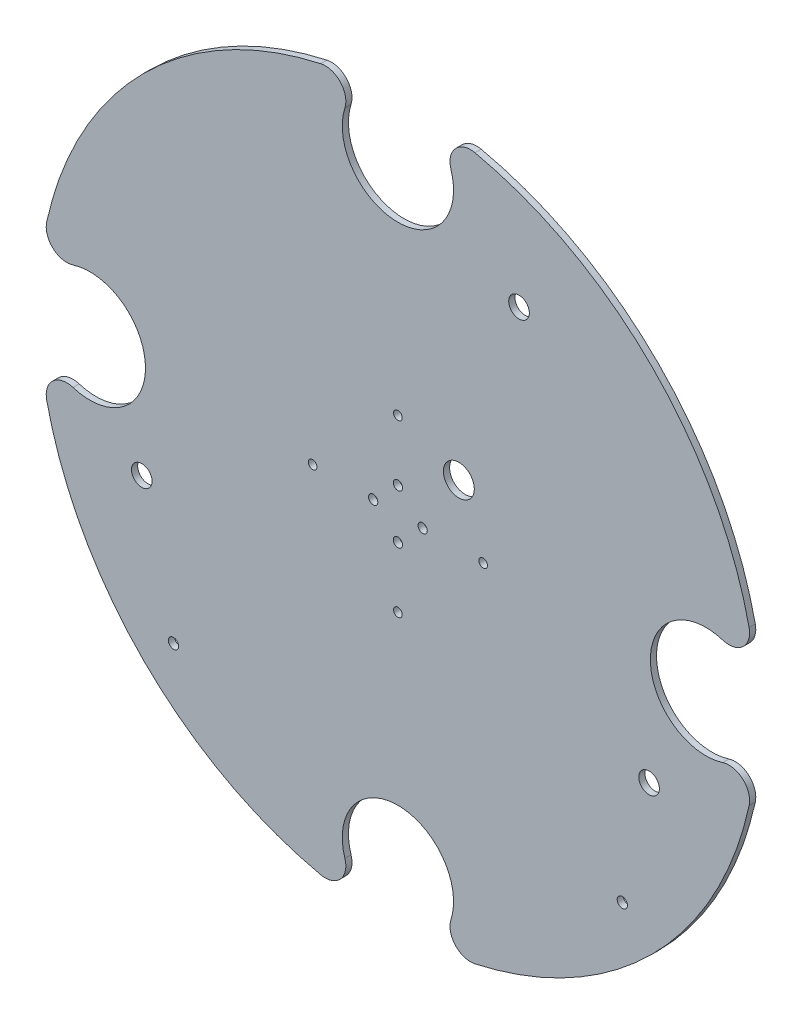
ISO-10303-21;
HEADER;
FILE_DESCRIPTION(('STEP AP214'),'2;1');
FILE_NAME('part.step','',(''),(''),'','','');
FILE_SCHEMA(('AUTOMOTIVE_DESIGN { 1 0 10303 214 1 1 1 1 }'));
ENDSEC;
DATA;
#1=APPLICATION_CONTEXT('core data for automotive mechanical design processes');
#2=APPLICATION_PROTOCOL_DEFINITION('international standard','automotive_design',2000,#1);
#3=PRODUCT_CONTEXT('',#1,'mechanical');
#4=PRODUCT('Part','Part','',(#3));
#5=PRODUCT_RELATED_PRODUCT_CATEGORY('part','',(#4));
#6=PRODUCT_DEFINITION_FORMATION('','',#4);
#7=PRODUCT_DEFINITION_CONTEXT('part definition',#1,'design');
#8=PRODUCT_DEFINITION('design','',#6,#7);
#9=PRODUCT_DEFINITION_SHAPE('','',#8);
#10=(LENGTH_UNIT() NAMED_UNIT(*) SI_UNIT(.MILLI.,.METRE.));
#11=(NAMED_UNIT(*) PLANE_ANGLE_UNIT() SI_UNIT($,.RADIAN.));
#12=(NAMED_UNIT(*) SI_UNIT($,.STERADIAN.) SOLID_ANGLE_UNIT());
#13=UNCERTAINTY_MEASURE_WITH_UNIT(LENGTH_MEASURE(1.E-05),#10,'distance_accuracy_value','');
#14=(GEOMETRIC_REPRESENTATION_CONTEXT(3) GLOBAL_UNCERTAINTY_ASSIGNED_CONTEXT((#13)) GLOBAL_UNIT_ASSIGNED_CONTEXT((#10,
#11,#12)) REPRESENTATION_CONTEXT('',''));
#15=CARTESIAN_POINT('',(0.,0.,0.));
#16=DIRECTION('',(0.,0.,1.));
#17=DIRECTION('',(1.,0.,0.));
#18=AXIS2_PLACEMENT_3D('',#15,#16,#17);
#19=CARTESIAN_POINT('',(0.,0.,3.));
#20=DIRECTION('',(0.,0.,-1.));
#21=DIRECTION('',(-1.,0.,0.));
#22=AXIS2_PLACEMENT_3D('',#19,#20,#21);
#23=CYLINDRICAL_SURFACE('',#22,174.5);
#24=CARTESIAN_POINT('',(0.,0.,0.));
#25=DIRECTION('',(0.,0.,1.));
#26=DIRECTION('',(1.,0.,0.));
#27=AXIS2_PLACEMENT_3D('',#24,#25,#26);
#28=CIRCLE('',#27,174.5);
#29=CARTESIAN_POINT('',(170.441324170741,37.4166408824233,0.));
#30=VERTEX_POINT('',#29);
#31=CARTESIAN_POINT('',(37.4166408824233,170.441324170741,0.));
#32=VERTEX_POINT('',#31);
#33=EDGE_CURVE('E249',#30,#32,#28,.T.);
#34=ORIENTED_EDGE('',*,*,#33,.T.);
#35=DIRECTION('',(0.,0.,-1.));
#36=VECTOR('',#35,1.);
#37=CARTESIAN_POINT('',(37.4166408824233,170.441324170741,3.));
#38=LINE('',#37,#36);
#39=CARTESIAN_POINT('',(37.4166408824233,170.441324170741,3.));
#40=VERTEX_POINT('',#39);
#41=EDGE_CURVE('E11',#40,#32,#38,.T.);
#42=ORIENTED_EDGE('',*,*,#41,.F.);
#43=CARTESIAN_POINT('',(0.,0.,3.));
#44=DIRECTION('',(0.,0.,1.));
#45=DIRECTION('',(1.,0.,0.));
#46=AXIS2_PLACEMENT_3D('',#43,#44,#45);
#47=CIRCLE('',#46,174.5);
#48=CARTESIAN_POINT('',(170.441324170741,37.4166408824233,3.));
#49=VERTEX_POINT('',#48);
#50=EDGE_CURVE('E370',#49,#40,#47,.T.);
#51=ORIENTED_EDGE('',*,*,#50,.F.);
#52=DIRECTION('',(0.,0.,-1.));
#53=VECTOR('',#52,1.);
#54=CARTESIAN_POINT('',(170.441324170741,37.4166408824233,3.));
#55=LINE('',#54,#53);
#56=EDGE_CURVE('E59',#49,#30,#55,.T.);
#57=ORIENTED_EDGE('',*,*,#56,.T.);
#58=EDGE_LOOP('',(#34,#42,#51,#57));
#59=FACE_BOUND('',#58,.T.);
#60=ADVANCED_FACE('F41',(#59),#23,.T.);
#61=CARTESIAN_POINT('',(35.272420774548,160.673913043478,3.));
#62=DIRECTION('',(0.,0.,-1.));
#63=DIRECTION('',(-1.,0.,0.));
#64=AXIS2_PLACEMENT_3D('',#61,#62,#63);
#65=CYLINDRICAL_SURFACE('',#64,9.99999999999998);
#66=CARTESIAN_POINT('',(35.272420774548,160.673913043478,0.));
#67=DIRECTION('',(0.,0.,1.));
#68=DIRECTION('',(1.,0.,0.));
#69=AXIS2_PLACEMENT_3D('',#66,#67,#68);
#70=CIRCLE('',#69,9.99999999999998);
#71=CARTESIAN_POINT('',(25.7393340787242,157.653936545241,0.));
#72=VERTEX_POINT('',#71);
#73=EDGE_CURVE('E252',#32,#72,#70,.T.);
#74=ORIENTED_EDGE('',*,*,#73,.T.);
#75=DIRECTION('',(0.,0.,-1.));
#76=VECTOR('',#75,1.);
#77=CARTESIAN_POINT('',(25.7393340787242,157.653936545241,3.));
#78=LINE('',#77,#76);
#79=CARTESIAN_POINT('',(25.7393340787242,157.653936545241,3.));
#80=VERTEX_POINT('',#79);
#81=EDGE_CURVE('E51',#80,#72,#78,.T.);
#82=ORIENTED_EDGE('',*,*,#81,.F.);
#83=CARTESIAN_POINT('',(35.272420774548,160.673913043478,3.));
#84=DIRECTION('',(0.,0.,1.));
#85=DIRECTION('',(1.,0.,0.));
#86=AXIS2_PLACEMENT_3D('',#83,#84,#85);
#87=CIRCLE('',#86,9.99999999999998);
#88=EDGE_CURVE('E121',#40,#80,#87,.T.);
#89=ORIENTED_EDGE('',*,*,#88,.F.);
#90=ORIENTED_EDGE('',*,*,#41,.T.);
#91=EDGE_LOOP('',(#74,#82,#89,#90));
#92=FACE_BOUND('',#91,.T.);
#93=ADVANCED_FACE('F351',(#92),#65,.T.);
#94=CARTESIAN_POINT('',(0.,149.5,3.));
#95=DIRECTION('',(0.,0.,-1.));
#96=DIRECTION('',(-1.,0.,0.));
#97=AXIS2_PLACEMENT_3D('',#94,#95,#96);
#98=CYLINDRICAL_SURFACE('',#97,26.9999999999998);
#99=CARTESIAN_POINT('',(0.,149.5,0.));
#100=DIRECTION('',(0.,0.,1.));
#101=DIRECTION('',(1.,0.,0.));
#102=AXIS2_PLACEMENT_3D('',#99,#100,#101);
#103=CIRCLE('',#102,26.9999999999998);
#104=CARTESIAN_POINT('',(-25.7393340787242,157.653936545241,0.));
#105=VERTEX_POINT('',#104);
#106=EDGE_CURVE('E256',#105,#72,#103,.T.);
#107=ORIENTED_EDGE('',*,*,#106,.F.);
#108=DIRECTION('',(0.,0.,-1.));
#109=VECTOR('',#108,1.);
#110=CARTESIAN_POINT('',(-25.7393340787242,157.653936545241,3.));
#111=LINE('',#110,#109);
#112=CARTESIAN_POINT('',(-25.7393340787242,157.653936545241,3.));
#113=VERTEX_POINT('',#112);
#114=EDGE_CURVE('E342',#113,#105,#111,.T.);
#115=ORIENTED_EDGE('',*,*,#114,.F.);
#116=CARTESIAN_POINT('',(0.,149.5,3.));
#117=DIRECTION('',(0.,0.,1.));
#118=DIRECTION('',(1.,0.,0.));
#119=AXIS2_PLACEMENT_3D('',#116,#117,#118);
#120=CIRCLE('',#119,26.9999999999998);
#121=EDGE_CURVE('E350',#113,#80,#120,.T.);
#122=ORIENTED_EDGE('',*,*,#121,.T.);
#123=ORIENTED_EDGE('',*,*,#81,.T.);
#124=EDGE_LOOP('',(#107,#115,#122,#123));
#125=FACE_BOUND('',#124,.T.);
#126=ADVANCED_FACE('F348',(#125),#98,.F.);
#127=CARTESIAN_POINT('',(-35.2724207745481,160.673913043478,3.));
#128=DIRECTION('',(0.,0.,-1.));
#129=DIRECTION('',(-1.,0.,0.));
#130=AXIS2_PLACEMENT_3D('',#127,#128,#129);
#131=CYLINDRICAL_SURFACE('',#130,9.99999999999998);
#132=CARTESIAN_POINT('',(-35.2724207745481,160.673913043478,0.));
#133=DIRECTION('',(0.,0.,1.));
#134=DIRECTION('',(1.,0.,0.));
#135=AXIS2_PLACEMENT_3D('',#132,#133,#134);
#136=CIRCLE('',#135,9.99999999999998);
#137=CARTESIAN_POINT('',(-37.4166408824233,170.441324170741,0.));
#138=VERTEX_POINT('',#137);
#139=EDGE_CURVE('E260',#138,#105,#136,.F.);
#140=ORIENTED_EDGE('',*,*,#139,.F.);
#141=DIRECTION('',(0.,0.,-1.));
#142=VECTOR('',#141,1.);
#143=CARTESIAN_POINT('',(-37.4166408824233,170.441324170741,3.));
#144=LINE('',#143,#142);
#145=CARTESIAN_POINT('',(-37.4166408824233,170.441324170741,3.));
#146=VERTEX_POINT('',#145);
#147=EDGE_CURVE('E339',#146,#138,#144,.T.);
#148=ORIENTED_EDGE('',*,*,#147,.F.);
#149=CARTESIAN_POINT('',(-35.2724207745481,160.673913043478,3.));
#150=DIRECTION('',(0.,0.,1.));
#151=DIRECTION('',(1.,0.,0.));
#152=AXIS2_PLACEMENT_3D('',#149,#150,#151);
#153=CIRCLE('',#152,9.99999999999998);
#154=EDGE_CURVE('E363',#146,#113,#153,.F.);
#155=ORIENTED_EDGE('',*,*,#154,.T.);
#156=ORIENTED_EDGE('',*,*,#114,.T.);
#157=EDGE_LOOP('',(#140,#148,#155,#156));
#158=FACE_BOUND('',#157,.T.);
#159=ADVANCED_FACE('F359',(#158),#131,.T.);
#160=CARTESIAN_POINT('',(0.,0.,3.));
#161=DIRECTION('',(0.,0.,-1.));
#162=DIRECTION('',(-1.,0.,0.));
#163=AXIS2_PLACEMENT_3D('',#160,#161,#162);
#164=CYLINDRICAL_SURFACE('',#163,174.5);
#165=CARTESIAN_POINT('',(0.,0.,0.));
#166=DIRECTION('',(0.,0.,1.));
#167=DIRECTION('',(1.,0.,0.));
#168=AXIS2_PLACEMENT_3D('',#165,#166,#167);
#169=CIRCLE('',#168,174.5);
#170=CARTESIAN_POINT('',(-170.441324170741,37.4166408824233,0.));
#171=VERTEX_POINT('',#170);
#172=EDGE_CURVE('E264',#138,#171,#169,.T.);
#173=ORIENTED_EDGE('',*,*,#172,.T.);
#174=DIRECTION('',(0.,0.,-1.));
#175=VECTOR('',#174,1.);
#176=CARTESIAN_POINT('',(-170.441324170741,37.4166408824233,3.));
#177=LINE('',#176,#175);
#178=CARTESIAN_POINT('',(-170.441324170741,37.4166408824233,3.));
#179=VERTEX_POINT('',#178);
#180=EDGE_CURVE('E335',#179,#171,#177,.T.);
#181=ORIENTED_EDGE('',*,*,#180,.F.);
#182=CARTESIAN_POINT('',(0.,0.,3.));
#183=DIRECTION('',(0.,0.,1.));
#184=DIRECTION('',(1.,0.,0.));
#185=AXIS2_PLACEMENT_3D('',#182,#183,#184);
#186=CIRCLE('',#185,174.5);
#187=EDGE_CURVE('E368',#146,#179,#186,.T.);
#188=ORIENTED_EDGE('',*,*,#187,.F.);
#189=ORIENTED_EDGE('',*,*,#147,.T.);
#190=EDGE_LOOP('',(#173,#181,#188,#189));
#191=FACE_BOUND('',#190,.T.);
#192=ADVANCED_FACE('F719',(#191),#164,.T.);
#193=CARTESIAN_POINT('',(-160.673913043478,35.272420774548,3.));
#194=DIRECTION('',(0.,0.,-1.));
#195=DIRECTION('',(-1.,0.,0.));
#196=AXIS2_PLACEMENT_3D('',#193,#194,#195);
#197=CYLINDRICAL_SURFACE('',#196,9.99999999999997);
#198=CARTESIAN_POINT('',(-160.673913043478,35.272420774548,0.));
#199=DIRECTION('',(0.,0.,1.));
#200=DIRECTION('',(1.,0.,0.));
#201=AXIS2_PLACEMENT_3D('',#198,#199,#200);
#202=CIRCLE('',#201,9.99999999999997);
#203=CARTESIAN_POINT('',(-157.653936545241,25.7393340787242,0.));
#204=VERTEX_POINT('',#203);
#205=EDGE_CURVE('E267',#171,#204,#202,.T.);
#206=ORIENTED_EDGE('',*,*,#205,.T.);
#207=DIRECTION('',(0.,0.,-1.));
#208=VECTOR('',#207,1.);
#209=CARTESIAN_POINT('',(-157.653936545241,25.7393340787242,3.));
#210=LINE('',#209,#208);
#211=CARTESIAN_POINT('',(-157.653936545241,25.7393340787242,3.));
#212=VERTEX_POINT('',#211);
#213=EDGE_CURVE('E332',#212,#204,#210,.T.);
#214=ORIENTED_EDGE('',*,*,#213,.F.);
#215=CARTESIAN_POINT('',(-160.673913043478,35.272420774548,3.));
#216=DIRECTION('',(0.,0.,1.));
#217=DIRECTION('',(1.,0.,0.));
#218=AXIS2_PLACEMENT_3D('',#215,#216,#217);
#219=CIRCLE('',#218,9.99999999999997);
#220=EDGE_CURVE('E376',#179,#212,#219,.T.);
#221=ORIENTED_EDGE('',*,*,#220,.F.);
#222=ORIENTED_EDGE('',*,*,#180,.T.);
#223=EDGE_LOOP('',(#206,#214,#221,#222));
#224=FACE_BOUND('',#223,.T.);
#225=ADVANCED_FACE('F709',(#224),#197,.T.);
#226=CARTESIAN_POINT('',(-149.5,0.,3.));
#227=DIRECTION('',(0.,0.,-1.));
#228=DIRECTION('',(-1.,0.,0.));
#229=AXIS2_PLACEMENT_3D('',#226,#227,#228);
#230=CYLINDRICAL_SURFACE('',#229,26.9999999999998);
#231=CARTESIAN_POINT('',(-149.5,0.,0.));
#232=DIRECTION('',(0.,0.,1.));
#233=DIRECTION('',(1.,0.,0.));
#234=AXIS2_PLACEMENT_3D('',#231,#232,#233);
#235=CIRCLE('',#234,26.9999999999998);
#236=CARTESIAN_POINT('',(-157.653936545241,-25.7393340787242,0.));
#237=VERTEX_POINT('',#236);
#238=EDGE_CURVE('E271',#237,#204,#235,.T.);
#239=ORIENTED_EDGE('',*,*,#238,.F.);
#240=DIRECTION('',(0.,0.,-1.));
#241=VECTOR('',#240,1.);
#242=CARTESIAN_POINT('',(-157.653936545241,-25.7393340787242,3.));
#243=LINE('',#242,#241);
#244=CARTESIAN_POINT('',(-157.653936545241,-25.7393340787242,3.));
#245=VERTEX_POINT('',#244);
#246=EDGE_CURVE('E329',#245,#237,#243,.T.);
#247=ORIENTED_EDGE('',*,*,#246,.F.);
#248=CARTESIAN_POINT('',(-149.5,0.,3.));
#249=DIRECTION('',(0.,0.,1.));
#250=DIRECTION('',(1.,0.,0.));
#251=AXIS2_PLACEMENT_3D('',#248,#249,#250);
#252=CIRCLE('',#251,26.9999999999998);
#253=EDGE_CURVE('E379',#245,#212,#252,.T.);
#254=ORIENTED_EDGE('',*,*,#253,.T.);
#255=ORIENTED_EDGE('',*,*,#213,.T.);
#256=EDGE_LOOP('',(#239,#247,#254,#255));
#257=FACE_BOUND('',#256,.T.);
#258=ADVANCED_FACE('F699',(#257),#230,.F.);
#259=CARTESIAN_POINT('',(-160.673913043478,-35.272420774548,3.));
#260=DIRECTION('',(0.,0.,-1.));
#261=DIRECTION('',(-1.,0.,0.));
#262=AXIS2_PLACEMENT_3D('',#259,#260,#261);
#263=CYLINDRICAL_SURFACE('',#262,9.99999999999997);
#264=CARTESIAN_POINT('',(-160.673913043478,-35.272420774548,0.));
#265=DIRECTION('',(0.,0.,1.));
#266=DIRECTION('',(1.,0.,0.));
#267=AXIS2_PLACEMENT_3D('',#264,#265,#266);
#268=CIRCLE('',#267,9.99999999999997);
#269=CARTESIAN_POINT('',(-170.441324170741,-37.4166408824233,0.));
#270=VERTEX_POINT('',#269);
#271=EDGE_CURVE('E275',#270,#237,#268,.F.);
#272=ORIENTED_EDGE('',*,*,#271,.F.);
#273=DIRECTION('',(0.,0.,-1.));
#274=VECTOR('',#273,1.);
#275=CARTESIAN_POINT('',(-170.441324170741,-37.4166408824233,3.));
#276=LINE('',#275,#274);
#277=CARTESIAN_POINT('',(-170.441324170741,-37.4166408824233,3.));
#278=VERTEX_POINT('',#277);
#279=EDGE_CURVE('E326',#278,#270,#276,.T.);
#280=ORIENTED_EDGE('',*,*,#279,.F.);
#281=CARTESIAN_POINT('',(-160.673913043478,-35.272420774548,3.));
#282=DIRECTION('',(0.,0.,1.));
#283=DIRECTION('',(1.,0.,0.));
#284=AXIS2_PLACEMENT_3D('',#281,#282,#283);
#285=CIRCLE('',#284,9.99999999999997);
#286=EDGE_CURVE('E383',#278,#245,#285,.F.);
#287=ORIENTED_EDGE('',*,*,#286,.T.);
#288=ORIENTED_EDGE('',*,*,#246,.T.);
#289=EDGE_LOOP('',(#272,#280,#287,#288));
#290=FACE_BOUND('',#289,.T.);
#291=ADVANCED_FACE('F687',(#290),#263,.T.);
#292=CARTESIAN_POINT('',(0.,0.,3.));
#293=DIRECTION('',(0.,0.,-1.));
#294=DIRECTION('',(-1.,0.,0.));
#295=AXIS2_PLACEMENT_3D('',#292,#293,#294);
#296=CYLINDRICAL_SURFACE('',#295,174.5);
#297=CARTESIAN_POINT('',(0.,0.,0.));
#298=DIRECTION('',(0.,0.,1.));
#299=DIRECTION('',(1.,0.,0.));
#300=AXIS2_PLACEMENT_3D('',#297,#298,#299);
#301=CIRCLE('',#300,174.5);
#302=CARTESIAN_POINT('',(-37.4166408824233,-170.441324170741,0.));
#303=VERTEX_POINT('',#302);
#304=EDGE_CURVE('E279',#270,#303,#301,.T.);
#305=ORIENTED_EDGE('',*,*,#304,.T.);
#306=DIRECTION('',(0.,0.,-1.));
#307=VECTOR('',#306,1.);
#308=CARTESIAN_POINT('',(-37.4166408824233,-170.441324170741,3.));
#309=LINE('',#308,#307);
#310=CARTESIAN_POINT('',(-37.4166408824233,-170.441324170741,3.));
#311=VERTEX_POINT('',#310);
#312=EDGE_CURVE('E322',#311,#303,#309,.T.);
#313=ORIENTED_EDGE('',*,*,#312,.F.);
#314=CARTESIAN_POINT('',(0.,0.,3.));
#315=DIRECTION('',(0.,0.,1.));
#316=DIRECTION('',(1.,0.,0.));
#317=AXIS2_PLACEMENT_3D('',#314,#315,#316);
#318=CIRCLE('',#317,174.5);
#319=EDGE_CURVE('E387',#278,#311,#318,.T.);
#320=ORIENTED_EDGE('',*,*,#319,.F.);
#321=ORIENTED_EDGE('',*,*,#279,.T.);
#322=EDGE_LOOP('',(#305,#313,#320,#321));
#323=FACE_BOUND('',#322,.T.);
#324=ADVANCED_FACE('F678',(#323),#296,.T.);
#325=CARTESIAN_POINT('',(-35.272420774548,-160.673913043478,3.));
#326=DIRECTION('',(0.,0.,-1.));
#327=DIRECTION('',(-1.,0.,0.));
#328=AXIS2_PLACEMENT_3D('',#325,#326,#327);
#329=CYLINDRICAL_SURFACE('',#328,9.99999999999998);
#330=CARTESIAN_POINT('',(-35.272420774548,-160.673913043478,0.));
#331=DIRECTION('',(0.,0.,1.));
#332=DIRECTION('',(1.,0.,0.));
#333=AXIS2_PLACEMENT_3D('',#330,#331,#332);
#334=CIRCLE('',#333,9.99999999999998);
#335=CARTESIAN_POINT('',(-25.7393340787242,-157.653936545241,0.));
#336=VERTEX_POINT('',#335);
#337=EDGE_CURVE('E282',#303,#336,#334,.T.);
#338=ORIENTED_EDGE('',*,*,#337,.T.);
#339=DIRECTION('',(0.,0.,-1.));
#340=VECTOR('',#339,1.);
#341=CARTESIAN_POINT('',(-25.7393340787242,-157.653936545241,3.));
#342=LINE('',#341,#340);
#343=CARTESIAN_POINT('',(-25.7393340787242,-157.653936545241,3.));
#344=VERTEX_POINT('',#343);
#345=EDGE_CURVE('E319',#344,#336,#342,.T.);
#346=ORIENTED_EDGE('',*,*,#345,.F.);
#347=CARTESIAN_POINT('',(-35.272420774548,-160.673913043478,3.));
#348=DIRECTION('',(0.,0.,1.));
#349=DIRECTION('',(1.,0.,0.));
#350=AXIS2_PLACEMENT_3D('',#347,#348,#349);
#351=CIRCLE('',#350,9.99999999999998);
#352=EDGE_CURVE('E390',#311,#344,#351,.T.);
#353=ORIENTED_EDGE('',*,*,#352,.F.);
#354=ORIENTED_EDGE('',*,*,#312,.T.);
#355=EDGE_LOOP('',(#338,#346,#353,#354));
#356=FACE_BOUND('',#355,.T.);
#357=ADVANCED_FACE('F670',(#356),#329,.T.);
#358=CARTESIAN_POINT('',(0.,-149.5,3.));
#359=DIRECTION('',(0.,0.,-1.));
#360=DIRECTION('',(-1.,0.,0.));
#361=AXIS2_PLACEMENT_3D('',#358,#359,#360);
#362=CYLINDRICAL_SURFACE('',#361,26.9999999999998);
#363=CARTESIAN_POINT('',(0.,-149.5,0.));
#364=DIRECTION('',(0.,0.,1.));
#365=DIRECTION('',(1.,0.,0.));
#366=AXIS2_PLACEMENT_3D('',#363,#364,#365);
#367=CIRCLE('',#366,26.9999999999998);
#368=CARTESIAN_POINT('',(25.7393340787242,-157.653936545241,0.));
#369=VERTEX_POINT('',#368);
#370=EDGE_CURVE('E286',#369,#336,#367,.T.);
#371=ORIENTED_EDGE('',*,*,#370,.F.);
#372=DIRECTION('',(0.,0.,-1.));
#373=VECTOR('',#372,1.);
#374=CARTESIAN_POINT('',(25.7393340787242,-157.653936545241,3.));
#375=LINE('',#374,#373);
#376=CARTESIAN_POINT('',(25.7393340787242,-157.653936545241,3.));
#377=VERTEX_POINT('',#376);
#378=EDGE_CURVE('E316',#377,#369,#375,.T.);
#379=ORIENTED_EDGE('',*,*,#378,.F.);
#380=CARTESIAN_POINT('',(0.,-149.5,3.));
#381=DIRECTION('',(0.,0.,1.));
#382=DIRECTION('',(1.,0.,0.));
#383=AXIS2_PLACEMENT_3D('',#380,#381,#382);
#384=CIRCLE('',#383,26.9999999999998);
#385=EDGE_CURVE('E393',#377,#344,#384,.T.);
#386=ORIENTED_EDGE('',*,*,#385,.T.);
#387=ORIENTED_EDGE('',*,*,#345,.T.);
#388=EDGE_LOOP('',(#371,#379,#386,#387));
#389=FACE_BOUND('',#388,.T.);
#390=ADVANCED_FACE('F409',(#389),#362,.F.);
#391=CARTESIAN_POINT('',(35.2724207745481,-160.673913043478,3.));
#392=DIRECTION('',(0.,0.,-1.));
#393=DIRECTION('',(-1.,0.,0.));
#394=AXIS2_PLACEMENT_3D('',#391,#392,#393);
#395=CYLINDRICAL_SURFACE('',#394,9.99999999999998);
#396=CARTESIAN_POINT('',(35.2724207745481,-160.673913043478,0.));
#397=DIRECTION('',(0.,0.,1.));
#398=DIRECTION('',(1.,0.,0.));
#399=AXIS2_PLACEMENT_3D('',#396,#397,#398);
#400=CIRCLE('',#399,9.99999999999998);
#401=CARTESIAN_POINT('',(37.4166408824233,-170.441324170741,0.));
#402=VERTEX_POINT('',#401);
#403=EDGE_CURVE('E290',#402,#369,#400,.F.);
#404=ORIENTED_EDGE('',*,*,#403,.F.);
#405=DIRECTION('',(0.,0.,-1.));
#406=VECTOR('',#405,1.);
#407=CARTESIAN_POINT('',(37.4166408824233,-170.441324170741,3.));
#408=LINE('',#407,#406);
#409=CARTESIAN_POINT('',(37.4166408824233,-170.441324170741,3.));
#410=VERTEX_POINT('',#409);
#411=EDGE_CURVE('E313',#410,#402,#408,.T.);
#412=ORIENTED_EDGE('',*,*,#411,.F.);
#413=CARTESIAN_POINT('',(35.2724207745481,-160.673913043478,3.));
#414=DIRECTION('',(0.,0.,1.));
#415=DIRECTION('',(1.,0.,0.));
#416=AXIS2_PLACEMENT_3D('',#413,#414,#415);
#417=CIRCLE('',#416,9.99999999999998);
#418=EDGE_CURVE('E397',#410,#377,#417,.F.);
#419=ORIENTED_EDGE('',*,*,#418,.T.);
#420=ORIENTED_EDGE('',*,*,#378,.T.);
#421=EDGE_LOOP('',(#404,#412,#419,#420));
#422=FACE_BOUND('',#421,.T.);
#423=ADVANCED_FACE('F403',(#422),#395,.T.);
#424=CARTESIAN_POINT('',(0.,0.,3.));
#425=DIRECTION('',(0.,0.,-1.));
#426=DIRECTION('',(-1.,0.,0.));
#427=AXIS2_PLACEMENT_3D('',#424,#425,#426);
#428=CYLINDRICAL_SURFACE('',#427,174.5);
#429=CARTESIAN_POINT('',(0.,0.,0.));
#430=DIRECTION('',(0.,0.,1.));
#431=DIRECTION('',(1.,0.,0.));
#432=AXIS2_PLACEMENT_3D('',#429,#430,#431);
#433=CIRCLE('',#432,174.5);
#434=CARTESIAN_POINT('',(170.441324170741,-37.4166408824233,0.));
#435=VERTEX_POINT('',#434);
#436=EDGE_CURVE('E294',#402,#435,#433,.T.);
#437=ORIENTED_EDGE('',*,*,#436,.T.);
#438=DIRECTION('',(0.,0.,-1.));
#439=VECTOR('',#438,1.);
#440=CARTESIAN_POINT('',(170.441324170741,-37.4166408824233,3.));
#441=LINE('',#440,#439);
#442=CARTESIAN_POINT('',(170.441324170741,-37.4166408824233,3.));
#443=VERTEX_POINT('',#442);
#444=EDGE_CURVE('E183',#443,#435,#441,.T.);
#445=ORIENTED_EDGE('',*,*,#444,.F.);
#446=CARTESIAN_POINT('',(0.,0.,3.));
#447=DIRECTION('',(0.,0.,1.));
#448=DIRECTION('',(1.,0.,0.));
#449=AXIS2_PLACEMENT_3D('',#446,#447,#448);
#450=CIRCLE('',#449,174.5);
#451=EDGE_CURVE('E169',#410,#443,#450,.T.);
#452=ORIENTED_EDGE('',*,*,#451,.F.);
#453=ORIENTED_EDGE('',*,*,#411,.T.);
#454=EDGE_LOOP('',(#437,#445,#452,#453));
#455=FACE_BOUND('',#454,.T.);
#456=ADVANCED_FACE('F413',(#455),#428,.T.);
#457=CARTESIAN_POINT('',(160.673913043478,-35.272420774548,3.));
#458=DIRECTION('',(0.,0.,-1.));
#459=DIRECTION('',(-1.,0.,0.));
#460=AXIS2_PLACEMENT_3D('',#457,#458,#459);
#461=CYLINDRICAL_SURFACE('',#460,9.99999999999998);
#462=CARTESIAN_POINT('',(160.673913043478,-35.272420774548,0.));
#463=DIRECTION('',(0.,0.,1.));
#464=DIRECTION('',(1.,0.,0.));
#465=AXIS2_PLACEMENT_3D('',#462,#463,#464);
#466=CIRCLE('',#465,9.99999999999998);
#467=CARTESIAN_POINT('',(157.653936545241,-25.7393340787242,0.));
#468=VERTEX_POINT('',#467);
#469=EDGE_CURVE('E179',#435,#468,#466,.T.);
#470=ORIENTED_EDGE('',*,*,#469,.T.);
#471=DIRECTION('',(0.,0.,-1.));
#472=VECTOR('',#471,1.);
#473=CARTESIAN_POINT('',(157.653936545241,-25.7393340787242,3.));
#474=LINE('',#473,#472);
#475=CARTESIAN_POINT('',(157.653936545241,-25.7393340787242,3.));
#476=VERTEX_POINT('',#475);
#477=EDGE_CURVE('E176',#476,#468,#474,.T.);
#478=ORIENTED_EDGE('',*,*,#477,.F.);
#479=CARTESIAN_POINT('',(160.673913043478,-35.272420774548,3.));
#480=DIRECTION('',(0.,0.,1.));
#481=DIRECTION('',(1.,0.,0.));
#482=AXIS2_PLACEMENT_3D('',#479,#480,#481);
#483=CIRCLE('',#482,9.99999999999998);
#484=EDGE_CURVE('E161',#443,#476,#483,.T.);
#485=ORIENTED_EDGE('',*,*,#484,.F.);
#486=ORIENTED_EDGE('',*,*,#444,.T.);
#487=EDGE_LOOP('',(#470,#478,#485,#486));
#488=FACE_BOUND('',#487,.T.);
#489=ADVANCED_FACE('F177',(#488),#461,.T.);
#490=CARTESIAN_POINT('',(149.5,0.,3.));
#491=DIRECTION('',(0.,0.,-1.));
#492=DIRECTION('',(-1.,0.,0.));
#493=AXIS2_PLACEMENT_3D('',#490,#491,#492);
#494=CYLINDRICAL_SURFACE('',#493,26.9999999999998);
#495=CARTESIAN_POINT('',(149.5,0.,0.));
#496=DIRECTION('',(0.,0.,1.));
#497=DIRECTION('',(1.,0.,0.));
#498=AXIS2_PLACEMENT_3D('',#495,#496,#497);
#499=CIRCLE('',#498,26.9999999999998);
#500=CARTESIAN_POINT('',(157.653936545241,25.7393340787242,0.));
#501=VERTEX_POINT('',#500);
#502=EDGE_CURVE('E299',#501,#468,#499,.T.);
#503=ORIENTED_EDGE('',*,*,#502,.F.);
#504=DIRECTION('',(0.,0.,-1.));
#505=VECTOR('',#504,1.);
#506=CARTESIAN_POINT('',(157.653936545241,25.7393340787242,3.));
#507=LINE('',#506,#505);
#508=CARTESIAN_POINT('',(157.653936545241,25.7393340787242,3.));
#509=VERTEX_POINT('',#508);
#510=EDGE_CURVE('E109',#509,#501,#507,.T.);
#511=ORIENTED_EDGE('',*,*,#510,.F.);
#512=CARTESIAN_POINT('',(149.5,0.,3.));
#513=DIRECTION('',(0.,0.,1.));
#514=DIRECTION('',(1.,0.,0.));
#515=AXIS2_PLACEMENT_3D('',#512,#513,#514);
#516=CIRCLE('',#515,26.9999999999998);
#517=EDGE_CURVE('E166',#509,#476,#516,.T.);
#518=ORIENTED_EDGE('',*,*,#517,.T.);
#519=ORIENTED_EDGE('',*,*,#477,.T.);
#520=EDGE_LOOP('',(#503,#511,#518,#519));
#521=FACE_BOUND('',#520,.T.);
#522=ADVANCED_FACE('F185',(#521),#494,.F.);
#523=CARTESIAN_POINT('',(-108.894444302729,-108.894444302728,3.));
#524=DIRECTION('',(0.,0.,-1.));
#525=DIRECTION('',(-1.,0.,0.));
#526=AXIS2_PLACEMENT_3D('',#523,#524,#525);
#527=CYLINDRICAL_SURFACE('',#526,2.50000000000001);
#528=CARTESIAN_POINT('',(-108.894444302729,-108.894444302728,3.));
#529=DIRECTION('',(0.,0.,1.));
#530=DIRECTION('',(1.,0.,0.));
#531=AXIS2_PLACEMENT_3D('',#528,#529,#530);
#532=CIRCLE('',#531,2.50000000000001);
#533=CARTESIAN_POINT('',(-106.394444302729,-108.894444302728,3.));
#534=VERTEX_POINT('',#533);
#535=EDGE_CURVE('E778',#534,#534,#532,.T.);
#536=ORIENTED_EDGE('',*,*,#535,.T.);
#537=EDGE_LOOP('',(#536));
#538=FACE_BOUND('',#537,.T.);
#539=CARTESIAN_POINT('',(-108.894444302729,-108.894444302728,0.));
#540=DIRECTION('',(0.,0.,1.));
#541=DIRECTION('',(1.,0.,0.));
#542=AXIS2_PLACEMENT_3D('',#539,#540,#541);
#543=CIRCLE('',#542,2.50000000000001);
#544=CARTESIAN_POINT('',(-106.394444302729,-108.894444302728,0.));
#545=VERTEX_POINT('',#544);
#546=EDGE_CURVE('E245',#545,#545,#543,.T.);
#547=ORIENTED_EDGE('',*,*,#546,.F.);
#548=EDGE_LOOP('',(#547));
#549=FACE_BOUND('',#548,.T.);
#550=ADVANCED_FACE('F430',(#538,#549),#527,.F.);
#551=CARTESIAN_POINT('',(108.894444302728,-108.894444302728,3.));
#552=DIRECTION('',(0.,0.,-1.));
#553=DIRECTION('',(-1.,0.,0.));
#554=AXIS2_PLACEMENT_3D('',#551,#552,#553);
#555=CYLINDRICAL_SURFACE('',#554,2.50000000000001);
#556=CARTESIAN_POINT('',(108.894444302728,-108.894444302728,3.));
#557=DIRECTION('',(0.,0.,1.));
#558=DIRECTION('',(1.,0.,0.));
#559=AXIS2_PLACEMENT_3D('',#556,#557,#558);
#560=CIRCLE('',#559,2.50000000000001);
#561=CARTESIAN_POINT('',(111.394444302728,-108.894444302728,3.));
#562=VERTEX_POINT('',#561);
#563=EDGE_CURVE('E781',#562,#562,#560,.T.);
#564=ORIENTED_EDGE('',*,*,#563,.T.);
#565=EDGE_LOOP('',(#564));
#566=FACE_BOUND('',#565,.T.);
#567=CARTESIAN_POINT('',(108.894444302728,-108.894444302728,0.));
#568=DIRECTION('',(0.,0.,1.));
#569=DIRECTION('',(1.,0.,0.));
#570=AXIS2_PLACEMENT_3D('',#567,#568,#569);
#571=CIRCLE('',#570,2.50000000000001);
#572=CARTESIAN_POINT('',(111.394444302728,-108.894444302728,0.));
#573=VERTEX_POINT('',#572);
#574=EDGE_CURVE('E241',#573,#573,#571,.T.);
#575=ORIENTED_EDGE('',*,*,#574,.F.);
#576=EDGE_LOOP('',(#575));
#577=FACE_BOUND('',#576,.T.);
#578=ADVANCED_FACE('F433',(#566,#577),#555,.F.);
#579=CARTESIAN_POINT('',(-124.289525038529,-46.0393490877078,3.));
#580=DIRECTION('',(0.,0.,-1.));
#581=DIRECTION('',(-1.,0.,0.));
#582=AXIS2_PLACEMENT_3D('',#579,#580,#581);
#583=CYLINDRICAL_SURFACE('',#582,5.00000000000001);
#584=CARTESIAN_POINT('',(-124.289525038529,-46.0393490877078,3.));
#585=DIRECTION('',(0.,0.,1.));
#586=DIRECTION('',(1.,0.,0.));
#587=AXIS2_PLACEMENT_3D('',#584,#585,#586);
#588=CIRCLE('',#587,5.00000000000001);
#589=CARTESIAN_POINT('',(-119.289525038529,-46.0393490877078,3.));
#590=VERTEX_POINT('',#589);
#591=EDGE_CURVE('E787',#590,#590,#588,.T.);
#592=ORIENTED_EDGE('',*,*,#591,.T.);
#593=EDGE_LOOP('',(#592));
#594=FACE_BOUND('',#593,.T.);
#595=CARTESIAN_POINT('',(-124.289525038529,-46.0393490877078,0.));
#596=DIRECTION('',(0.,0.,1.));
#597=DIRECTION('',(1.,0.,0.));
#598=AXIS2_PLACEMENT_3D('',#595,#596,#597);
#599=CIRCLE('',#598,5.00000000000001);
#600=CARTESIAN_POINT('',(-119.289525038529,-46.0393490877078,0.));
#601=VERTEX_POINT('',#600);
#602=EDGE_CURVE('E237',#601,#601,#599,.T.);
#603=ORIENTED_EDGE('',*,*,#602,.F.);
#604=EDGE_LOOP('',(#603));
#605=FACE_BOUND('',#604,.T.);
#606=ADVANCED_FACE('F437',(#594,#605),#583,.F.);
#607=CARTESIAN_POINT('',(58.7754444515296,116.257983947559,3.));
#608=DIRECTION('',(0.,0.,-1.));
#609=DIRECTION('',(-1.,0.,0.));
#610=AXIS2_PLACEMENT_3D('',#607,#608,#609);
#611=CYLINDRICAL_SURFACE('',#610,5.00000000000001);
#612=CARTESIAN_POINT('',(58.7754444515296,116.257983947559,3.));
#613=DIRECTION('',(0.,0.,1.));
#614=DIRECTION('',(1.,0.,0.));
#615=AXIS2_PLACEMENT_3D('',#612,#613,#614);
#616=CIRCLE('',#615,5.00000000000001);
#617=CARTESIAN_POINT('',(63.7754444515296,116.257983947559,3.));
#618=VERTEX_POINT('',#617);
#619=EDGE_CURVE('E791',#618,#618,#616,.T.);
#620=ORIENTED_EDGE('',*,*,#619,.T.);
#621=EDGE_LOOP('',(#620));
#622=FACE_BOUND('',#621,.T.);
#623=CARTESIAN_POINT('',(58.7754444515296,116.257983947559,0.));
#624=DIRECTION('',(0.,0.,1.));
#625=DIRECTION('',(1.,0.,0.));
#626=AXIS2_PLACEMENT_3D('',#623,#624,#625);
#627=CIRCLE('',#626,5.00000000000001);
#628=CARTESIAN_POINT('',(63.7754444515296,116.257983947559,0.));
#629=VERTEX_POINT('',#628);
#630=EDGE_CURVE('E233',#629,#629,#627,.T.);
#631=ORIENTED_EDGE('',*,*,#630,.F.);
#632=EDGE_LOOP('',(#631));
#633=FACE_BOUND('',#632,.T.);
#634=ADVANCED_FACE('F441',(#622,#633),#611,.F.);
#635=CARTESIAN_POINT('',(121.87339966259,-52.131018514207,3.));
#636=DIRECTION('',(0.,0.,-1.));
#637=DIRECTION('',(-1.,0.,0.));
#638=AXIS2_PLACEMENT_3D('',#635,#636,#637);
#639=CYLINDRICAL_SURFACE('',#638,5.00000000000002);
#640=CARTESIAN_POINT('',(121.87339966259,-52.131018514207,3.));
#641=DIRECTION('',(0.,0.,1.));
#642=DIRECTION('',(1.,0.,0.));
#643=AXIS2_PLACEMENT_3D('',#640,#641,#642);
#644=CIRCLE('',#643,5.00000000000002);
#645=CARTESIAN_POINT('',(126.87339966259,-52.131018514207,3.));
#646=VERTEX_POINT('',#645);
#647=EDGE_CURVE('E795',#646,#646,#644,.T.);
#648=ORIENTED_EDGE('',*,*,#647,.T.);
#649=EDGE_LOOP('',(#648));
#650=FACE_BOUND('',#649,.T.);
#651=CARTESIAN_POINT('',(121.87339966259,-52.131018514207,0.));
#652=DIRECTION('',(0.,0.,1.));
#653=DIRECTION('',(1.,0.,0.));
#654=AXIS2_PLACEMENT_3D('',#651,#652,#653);
#655=CIRCLE('',#654,5.00000000000002);
#656=CARTESIAN_POINT('',(126.87339966259,-52.131018514207,0.));
#657=VERTEX_POINT('',#656);
#658=EDGE_CURVE('E229',#657,#657,#655,.T.);
#659=ORIENTED_EDGE('',*,*,#658,.F.);
#660=EDGE_LOOP('',(#659));
#661=FACE_BOUND('',#660,.T.);
#662=ADVANCED_FACE('F445',(#650,#661),#639,.F.);
#663=CARTESIAN_POINT('',(0.,12.,3.));
#664=DIRECTION('',(0.,0.,-1.));
#665=DIRECTION('',(-1.,0.,0.));
#666=AXIS2_PLACEMENT_3D('',#663,#664,#665);
#667=CYLINDRICAL_SURFACE('',#666,2.25);
#668=CARTESIAN_POINT('',(0.,12.,3.));
#669=DIRECTION('',(0.,0.,1.));
#670=DIRECTION('',(1.,0.,0.));
#671=AXIS2_PLACEMENT_3D('',#668,#669,#670);
#672=CIRCLE('',#671,2.25);
#673=CARTESIAN_POINT('',(2.25,12.,3.));
#674=VERTEX_POINT('',#673);
#675=EDGE_CURVE('E799',#674,#674,#672,.T.);
#676=ORIENTED_EDGE('',*,*,#675,.T.);
#677=EDGE_LOOP('',(#676));
#678=FACE_BOUND('',#677,.T.);
#679=CARTESIAN_POINT('',(0.,12.,0.));
#680=DIRECTION('',(0.,0.,1.));
#681=DIRECTION('',(1.,0.,0.));
#682=AXIS2_PLACEMENT_3D('',#679,#680,#681);
#683=CIRCLE('',#682,2.25);
#684=CARTESIAN_POINT('',(2.25,12.,0.));
#685=VERTEX_POINT('',#684);
#686=EDGE_CURVE('E225',#685,#685,#683,.T.);
#687=ORIENTED_EDGE('',*,*,#686,.F.);
#688=EDGE_LOOP('',(#687));
#689=FACE_BOUND('',#688,.T.);
#690=ADVANCED_FACE('F449',(#678,#689),#667,.F.);
#691=CARTESIAN_POINT('',(-12.,0.,3.));
#692=DIRECTION('',(0.,0.,-1.));
#693=DIRECTION('',(-1.,0.,0.));
#694=AXIS2_PLACEMENT_3D('',#691,#692,#693);
#695=CYLINDRICAL_SURFACE('',#694,2.25);
#696=CARTESIAN_POINT('',(-12.,0.,3.));
#697=DIRECTION('',(0.,0.,1.));
#698=DIRECTION('',(1.,0.,0.));
#699=AXIS2_PLACEMENT_3D('',#696,#697,#698);
#700=CIRCLE('',#699,2.25);
#701=CARTESIAN_POINT('',(-9.75,0.,3.));
#702=VERTEX_POINT('',#701);
#703=EDGE_CURVE('E803',#702,#702,#700,.T.);
#704=ORIENTED_EDGE('',*,*,#703,.T.);
#705=EDGE_LOOP('',(#704));
#706=FACE_BOUND('',#705,.T.);
#707=CARTESIAN_POINT('',(-12.,0.,0.));
#708=DIRECTION('',(0.,0.,1.));
#709=DIRECTION('',(1.,0.,0.));
#710=AXIS2_PLACEMENT_3D('',#707,#708,#709);
#711=CIRCLE('',#710,2.25);
#712=CARTESIAN_POINT('',(-9.75,0.,0.));
#713=VERTEX_POINT('',#712);
#714=EDGE_CURVE('E221',#713,#713,#711,.T.);
#715=ORIENTED_EDGE('',*,*,#714,.F.);
#716=EDGE_LOOP('',(#715));
#717=FACE_BOUND('',#716,.T.);
#718=ADVANCED_FACE('F453',(#706,#717),#695,.F.);
#719=CARTESIAN_POINT('',(0.,-12.,3.));
#720=DIRECTION('',(0.,0.,-1.));
#721=DIRECTION('',(-1.,0.,0.));
#722=AXIS2_PLACEMENT_3D('',#719,#720,#721);
#723=CYLINDRICAL_SURFACE('',#722,2.25);
#724=CARTESIAN_POINT('',(0.,-12.,3.));
#725=DIRECTION('',(0.,0.,1.));
#726=DIRECTION('',(1.,0.,0.));
#727=AXIS2_PLACEMENT_3D('',#724,#725,#726);
#728=CIRCLE('',#727,2.25);
#729=CARTESIAN_POINT('',(2.25,-12.,3.));
#730=VERTEX_POINT('',#729);
#731=EDGE_CURVE('E807',#730,#730,#728,.T.);
#732=ORIENTED_EDGE('',*,*,#731,.T.);
#733=EDGE_LOOP('',(#732));
#734=FACE_BOUND('',#733,.T.);
#735=CARTESIAN_POINT('',(0.,-12.,0.));
#736=DIRECTION('',(0.,0.,1.));
#737=DIRECTION('',(1.,0.,0.));
#738=AXIS2_PLACEMENT_3D('',#735,#736,#737);
#739=CIRCLE('',#738,2.25);
#740=CARTESIAN_POINT('',(2.25,-12.,0.));
#741=VERTEX_POINT('',#740);
#742=EDGE_CURVE('E217',#741,#741,#739,.T.);
#743=ORIENTED_EDGE('',*,*,#742,.F.);
#744=EDGE_LOOP('',(#743));
#745=FACE_BOUND('',#744,.T.);
#746=ADVANCED_FACE('F457',(#734,#745),#723,.F.);
#747=CARTESIAN_POINT('',(12.,0.,3.));
#748=DIRECTION('',(0.,0.,-1.));
#749=DIRECTION('',(-1.,0.,0.));
#750=AXIS2_PLACEMENT_3D('',#747,#748,#749);
#751=CYLINDRICAL_SURFACE('',#750,2.25);
#752=CARTESIAN_POINT('',(12.,0.,3.));
#753=DIRECTION('',(0.,0.,1.));
#754=DIRECTION('',(1.,0.,0.));
#755=AXIS2_PLACEMENT_3D('',#752,#753,#754);
#756=CIRCLE('',#755,2.25);
#757=CARTESIAN_POINT('',(14.25,0.,3.));
#758=VERTEX_POINT('',#757);
#759=EDGE_CURVE('E811',#758,#758,#756,.T.);
#760=ORIENTED_EDGE('',*,*,#759,.T.);
#761=EDGE_LOOP('',(#760));
#762=FACE_BOUND('',#761,.T.);
#763=CARTESIAN_POINT('',(12.,0.,0.));
#764=DIRECTION('',(0.,0.,1.));
#765=DIRECTION('',(1.,0.,0.));
#766=AXIS2_PLACEMENT_3D('',#763,#764,#765);
#767=CIRCLE('',#766,2.25);
#768=CARTESIAN_POINT('',(14.25,0.,0.));
#769=VERTEX_POINT('',#768);
#770=EDGE_CURVE('E213',#769,#769,#767,.T.);
#771=ORIENTED_EDGE('',*,*,#770,.F.);
#772=EDGE_LOOP('',(#771));
#773=FACE_BOUND('',#772,.T.);
#774=ADVANCED_FACE('F461',(#762,#773),#751,.F.);
#775=CARTESIAN_POINT('',(41.37,0.,3.));
#776=DIRECTION('',(0.,0.,-1.));
#777=DIRECTION('',(-1.,0.,0.));
#778=AXIS2_PLACEMENT_3D('',#775,#776,#777);
#779=CYLINDRICAL_SURFACE('',#778,2.1);
#780=CARTESIAN_POINT('',(41.37,0.,3.));
#781=DIRECTION('',(0.,0.,1.));
#782=DIRECTION('',(1.,0.,0.));
#783=AXIS2_PLACEMENT_3D('',#780,#781,#782);
#784=CIRCLE('',#783,2.1);
#785=CARTESIAN_POINT('',(43.47,0.,3.));
#786=VERTEX_POINT('',#785);
#787=EDGE_CURVE('E815',#786,#786,#784,.T.);
#788=ORIENTED_EDGE('',*,*,#787,.T.);
#789=EDGE_LOOP('',(#788));
#790=FACE_BOUND('',#789,.T.);
#791=CARTESIAN_POINT('',(41.37,0.,0.));
#792=DIRECTION('',(0.,0.,1.));
#793=DIRECTION('',(1.,0.,0.));
#794=AXIS2_PLACEMENT_3D('',#791,#792,#793);
#795=CIRCLE('',#794,2.1);
#796=CARTESIAN_POINT('',(43.47,0.,0.));
#797=VERTEX_POINT('',#796);
#798=EDGE_CURVE('E209',#797,#797,#795,.T.);
#799=ORIENTED_EDGE('',*,*,#798,.F.);
#800=EDGE_LOOP('',(#799));
#801=FACE_BOUND('',#800,.T.);
#802=ADVANCED_FACE('F465',(#790,#801),#779,.F.);
#803=CARTESIAN_POINT('',(-1.4444258298794E-13,-41.37,3.));
#804=DIRECTION('',(0.,0.,-1.));
#805=DIRECTION('',(-1.,0.,0.));
#806=AXIS2_PLACEMENT_3D('',#803,#804,#805);
#807=CYLINDRICAL_SURFACE('',#806,2.1);
#808=CARTESIAN_POINT('',(-1.4444258298794E-13,-41.37,3.));
#809=DIRECTION('',(0.,0.,1.));
#810=DIRECTION('',(1.,0.,0.));
#811=AXIS2_PLACEMENT_3D('',#808,#809,#810);
#812=CIRCLE('',#811,2.1);
#813=CARTESIAN_POINT('',(2.09999999999985,-41.37,3.));
#814=VERTEX_POINT('',#813);
#815=EDGE_CURVE('E819',#814,#814,#812,.T.);
#816=ORIENTED_EDGE('',*,*,#815,.T.);
#817=EDGE_LOOP('',(#816));
#818=FACE_BOUND('',#817,.T.);
#819=CARTESIAN_POINT('',(-1.4444258298794E-13,-41.37,0.));
#820=DIRECTION('',(0.,0.,1.));
#821=DIRECTION('',(1.,0.,0.));
#822=AXIS2_PLACEMENT_3D('',#819,#820,#821);
#823=CIRCLE('',#822,2.1);
#824=CARTESIAN_POINT('',(2.09999999999985,-41.37,0.));
#825=VERTEX_POINT('',#824);
#826=EDGE_CURVE('E205',#825,#825,#823,.T.);
#827=ORIENTED_EDGE('',*,*,#826,.F.);
#828=EDGE_LOOP('',(#827));
#829=FACE_BOUND('',#828,.T.);
#830=ADVANCED_FACE('F469',(#818,#829),#807,.F.);
#831=CARTESIAN_POINT('',(-41.37,2.88885165975881E-13,3.));
#832=DIRECTION('',(0.,0.,-1.));
#833=DIRECTION('',(-1.,0.,0.));
#834=AXIS2_PLACEMENT_3D('',#831,#832,#833);
#835=CYLINDRICAL_SURFACE('',#834,2.1);
#836=CARTESIAN_POINT('',(-41.37,2.88885165975881E-13,3.));
#837=DIRECTION('',(0.,0.,1.));
#838=DIRECTION('',(1.,0.,0.));
#839=AXIS2_PLACEMENT_3D('',#836,#837,#838);
#840=CIRCLE('',#839,2.1);
#841=CARTESIAN_POINT('',(-39.27,2.88885165975881E-13,3.));
#842=VERTEX_POINT('',#841);
#843=EDGE_CURVE('E823',#842,#842,#840,.T.);
#844=ORIENTED_EDGE('',*,*,#843,.T.);
#845=EDGE_LOOP('',(#844));
#846=FACE_BOUND('',#845,.T.);
#847=CARTESIAN_POINT('',(-41.37,2.88885165975881E-13,0.));
#848=DIRECTION('',(0.,0.,1.));
#849=DIRECTION('',(1.,0.,0.));
#850=AXIS2_PLACEMENT_3D('',#847,#848,#849);
#851=CIRCLE('',#850,2.1);
#852=CARTESIAN_POINT('',(-39.27,2.88885165975881E-13,0.));
#853=VERTEX_POINT('',#852);
#854=EDGE_CURVE('E201',#853,#853,#851,.T.);
#855=ORIENTED_EDGE('',*,*,#854,.F.);
#856=EDGE_LOOP('',(#855));
#857=FACE_BOUND('',#856,.T.);
#858=ADVANCED_FACE('F473',(#846,#857),#835,.F.);
#859=CARTESIAN_POINT('',(4.33327748963821E-13,41.37,3.));
#860=DIRECTION('',(0.,0.,-1.));
#861=DIRECTION('',(-1.,0.,0.));
#862=AXIS2_PLACEMENT_3D('',#859,#860,#861);
#863=CYLINDRICAL_SURFACE('',#862,2.1);
#864=CARTESIAN_POINT('',(4.33327748963821E-13,41.37,3.));
#865=DIRECTION('',(0.,0.,1.));
#866=DIRECTION('',(1.,0.,0.));
#867=AXIS2_PLACEMENT_3D('',#864,#865,#866);
#868=CIRCLE('',#867,2.1);
#869=CARTESIAN_POINT('',(2.10000000000043,41.37,3.));
#870=VERTEX_POINT('',#869);
#871=EDGE_CURVE('E488',#870,#870,#868,.T.);
#872=ORIENTED_EDGE('',*,*,#871,.T.);
#873=EDGE_LOOP('',(#872));
#874=FACE_BOUND('',#873,.T.);
#875=CARTESIAN_POINT('',(4.33327748963821E-13,41.37,0.));
#876=DIRECTION('',(0.,0.,1.));
#877=DIRECTION('',(1.,0.,0.));
#878=AXIS2_PLACEMENT_3D('',#875,#876,#877);
#879=CIRCLE('',#878,2.1);
#880=CARTESIAN_POINT('',(2.10000000000043,41.37,0.));
#881=VERTEX_POINT('',#880);
#882=EDGE_CURVE('E197',#881,#881,#879,.T.);
#883=ORIENTED_EDGE('',*,*,#882,.F.);
#884=EDGE_LOOP('',(#883));
#885=FACE_BOUND('',#884,.T.);
#886=ADVANCED_FACE('F476',(#874,#885),#863,.F.);
#887=CARTESIAN_POINT('',(29.5728125978264,28.9296673858141,3.));
#888=DIRECTION('',(0.,0.,-1.));
#889=DIRECTION('',(-1.,0.,0.));
#890=AXIS2_PLACEMENT_3D('',#887,#888,#889);
#891=CYLINDRICAL_SURFACE('',#890,7.5);
#892=CARTESIAN_POINT('',(29.5728125978264,28.9296673858141,3.));
#893=DIRECTION('',(0.,0.,1.));
#894=DIRECTION('',(1.,0.,0.));
#895=AXIS2_PLACEMENT_3D('',#892,#893,#894);
#896=CIRCLE('',#895,7.5);
#897=CARTESIAN_POINT('',(37.0728125978264,28.9296673858141,3.));
#898=VERTEX_POINT('',#897);
#899=EDGE_CURVE('E306',#898,#898,#896,.T.);
#900=ORIENTED_EDGE('',*,*,#899,.T.);
#901=EDGE_LOOP('',(#900));
#902=FACE_BOUND('',#901,.T.);
#903=CARTESIAN_POINT('',(29.5728125978264,28.9296673858141,0.));
#904=DIRECTION('',(0.,0.,1.));
#905=DIRECTION('',(1.,0.,0.));
#906=AXIS2_PLACEMENT_3D('',#903,#904,#905);
#907=CIRCLE('',#906,7.5);
#908=CARTESIAN_POINT('',(37.0728125978264,28.9296673858141,0.));
#909=VERTEX_POINT('',#908);
#910=EDGE_CURVE('E193',#909,#909,#907,.T.);
#911=ORIENTED_EDGE('',*,*,#910,.F.);
#912=EDGE_LOOP('',(#911));
#913=FACE_BOUND('',#912,.T.);
#914=ADVANCED_FACE('F43',(#902,#913),#891,.F.);
#915=CARTESIAN_POINT('',(160.673913043478,35.2724207745481,3.));
#916=DIRECTION('',(0.,0.,-1.));
#917=DIRECTION('',(-1.,0.,0.));
#918=AXIS2_PLACEMENT_3D('',#915,#916,#917);
#919=CYLINDRICAL_SURFACE('',#918,9.99999999999998);
#920=CARTESIAN_POINT('',(160.673913043478,35.2724207745481,0.));
#921=DIRECTION('',(0.,0.,1.));
#922=DIRECTION('',(1.,0.,0.));
#923=AXIS2_PLACEMENT_3D('',#920,#921,#922);
#924=CIRCLE('',#923,9.99999999999998);
#925=EDGE_CURVE('E302',#30,#501,#924,.F.);
#926=ORIENTED_EDGE('',*,*,#925,.F.);
#927=ORIENTED_EDGE('',*,*,#56,.F.);
#928=CARTESIAN_POINT('',(160.673913043478,35.2724207745481,3.));
#929=DIRECTION('',(0.,0.,1.));
#930=DIRECTION('',(1.,0.,0.));
#931=AXIS2_PLACEMENT_3D('',#928,#929,#930);
#932=CIRCLE('',#931,9.99999999999998);
#933=EDGE_CURVE('E187',#49,#509,#932,.F.);
#934=ORIENTED_EDGE('',*,*,#933,.T.);
#935=ORIENTED_EDGE('',*,*,#510,.T.);
#936=EDGE_LOOP('',(#926,#927,#934,#935));
#937=FACE_BOUND('',#936,.T.);
#938=ADVANCED_FACE('F483',(#937),#919,.T.);
#939=CARTESIAN_POINT('',(0.,0.,3.));
#940=DIRECTION('',(0.,0.,1.));
#941=DIRECTION('',(1.,0.,0.));
#942=AXIS2_PLACEMENT_3D('',#939,#940,#941);
#943=PLANE('',#942);
#944=ORIENTED_EDGE('',*,*,#899,.F.);
#945=EDGE_LOOP('',(#944));
#946=FACE_BOUND('',#945,.T.);
#947=ORIENTED_EDGE('',*,*,#871,.F.);
#948=EDGE_LOOP('',(#947));
#949=FACE_BOUND('',#948,.T.);
#950=ORIENTED_EDGE('',*,*,#843,.F.);
#951=EDGE_LOOP('',(#950));
#952=FACE_BOUND('',#951,.T.);
#953=ORIENTED_EDGE('',*,*,#815,.F.);
#954=EDGE_LOOP('',(#953));
#955=FACE_BOUND('',#954,.T.);
#956=ORIENTED_EDGE('',*,*,#787,.F.);
#957=EDGE_LOOP('',(#956));
#958=FACE_BOUND('',#957,.T.);
#959=ORIENTED_EDGE('',*,*,#759,.F.);
#960=EDGE_LOOP('',(#959));
#961=FACE_BOUND('',#960,.T.);
#962=ORIENTED_EDGE('',*,*,#731,.F.);
#963=EDGE_LOOP('',(#962));
#964=FACE_BOUND('',#963,.T.);
#965=ORIENTED_EDGE('',*,*,#703,.F.);
#966=EDGE_LOOP('',(#965));
#967=FACE_BOUND('',#966,.T.);
#968=ORIENTED_EDGE('',*,*,#675,.F.);
#969=EDGE_LOOP('',(#968));
#970=FACE_BOUND('',#969,.T.);
#971=ORIENTED_EDGE('',*,*,#647,.F.);
#972=EDGE_LOOP('',(#971));
#973=FACE_BOUND('',#972,.T.);
#974=ORIENTED_EDGE('',*,*,#619,.F.);
#975=EDGE_LOOP('',(#974));
#976=FACE_BOUND('',#975,.T.);
#977=ORIENTED_EDGE('',*,*,#591,.F.);
#978=EDGE_LOOP('',(#977));
#979=FACE_BOUND('',#978,.T.);
#980=ORIENTED_EDGE('',*,*,#563,.F.);
#981=EDGE_LOOP('',(#980));
#982=FACE_BOUND('',#981,.T.);
#983=ORIENTED_EDGE('',*,*,#535,.F.);
#984=EDGE_LOOP('',(#983));
#985=FACE_BOUND('',#984,.T.);
#986=ORIENTED_EDGE('',*,*,#50,.T.);
#987=ORIENTED_EDGE('',*,*,#88,.T.);
#988=ORIENTED_EDGE('',*,*,#121,.F.);
#989=ORIENTED_EDGE('',*,*,#154,.F.);
#990=ORIENTED_EDGE('',*,*,#187,.T.);
#991=ORIENTED_EDGE('',*,*,#220,.T.);
#992=ORIENTED_EDGE('',*,*,#253,.F.);
#993=ORIENTED_EDGE('',*,*,#286,.F.);
#994=ORIENTED_EDGE('',*,*,#319,.T.);
#995=ORIENTED_EDGE('',*,*,#352,.T.);
#996=ORIENTED_EDGE('',*,*,#385,.F.);
#997=ORIENTED_EDGE('',*,*,#418,.F.);
#998=ORIENTED_EDGE('',*,*,#451,.T.);
#999=ORIENTED_EDGE('',*,*,#484,.T.);
#1000=ORIENTED_EDGE('',*,*,#517,.F.);
#1001=ORIENTED_EDGE('',*,*,#933,.F.);
#1002=EDGE_LOOP('',(#986,#987,#988,#989,#990,#991,#992,#993,#994,#995,#996,#997,#998,#999,#1000,#1001));
#1003=FACE_BOUND('',#1002,.T.);
#1004=ADVANCED_FACE('F163',(#946,#949,#952,#955,#958,#961,#964,#967,#970,#973,#976,#979,#982,
#985,#1003),#943,.T.);
#1005=CARTESIAN_POINT('',(0.,0.,0.));
#1006=DIRECTION('',(0.,0.,1.));
#1007=DIRECTION('',(1.,0.,0.));
#1008=AXIS2_PLACEMENT_3D('',#1005,#1006,#1007);
#1009=PLANE('',#1008);
#1010=ORIENTED_EDGE('',*,*,#910,.T.);
#1011=EDGE_LOOP('',(#1010));
#1012=FACE_BOUND('',#1011,.T.);
#1013=ORIENTED_EDGE('',*,*,#882,.T.);
#1014=EDGE_LOOP('',(#1013));
#1015=FACE_BOUND('',#1014,.T.);
#1016=ORIENTED_EDGE('',*,*,#854,.T.);
#1017=EDGE_LOOP('',(#1016));
#1018=FACE_BOUND('',#1017,.T.);
#1019=ORIENTED_EDGE('',*,*,#826,.T.);
#1020=EDGE_LOOP('',(#1019));
#1021=FACE_BOUND('',#1020,.T.);
#1022=ORIENTED_EDGE('',*,*,#798,.T.);
#1023=EDGE_LOOP('',(#1022));
#1024=FACE_BOUND('',#1023,.T.);
#1025=ORIENTED_EDGE('',*,*,#770,.T.);
#1026=EDGE_LOOP('',(#1025));
#1027=FACE_BOUND('',#1026,.T.);
#1028=ORIENTED_EDGE('',*,*,#742,.T.);
#1029=EDGE_LOOP('',(#1028));
#1030=FACE_BOUND('',#1029,.T.);
#1031=ORIENTED_EDGE('',*,*,#714,.T.);
#1032=EDGE_LOOP('',(#1031));
#1033=FACE_BOUND('',#1032,.T.);
#1034=ORIENTED_EDGE('',*,*,#686,.T.);
#1035=EDGE_LOOP('',(#1034));
#1036=FACE_BOUND('',#1035,.T.);
#1037=ORIENTED_EDGE('',*,*,#658,.T.);
#1038=EDGE_LOOP('',(#1037));
#1039=FACE_BOUND('',#1038,.T.);
#1040=ORIENTED_EDGE('',*,*,#630,.T.);
#1041=EDGE_LOOP('',(#1040));
#1042=FACE_BOUND('',#1041,.T.);
#1043=ORIENTED_EDGE('',*,*,#602,.T.);
#1044=EDGE_LOOP('',(#1043));
#1045=FACE_BOUND('',#1044,.T.);
#1046=ORIENTED_EDGE('',*,*,#574,.T.);
#1047=EDGE_LOOP('',(#1046));
#1048=FACE_BOUND('',#1047,.T.);
#1049=ORIENTED_EDGE('',*,*,#546,.T.);
#1050=EDGE_LOOP('',(#1049));
#1051=FACE_BOUND('',#1050,.T.);
#1052=ORIENTED_EDGE('',*,*,#33,.F.);
#1053=ORIENTED_EDGE('',*,*,#925,.T.);
#1054=ORIENTED_EDGE('',*,*,#502,.T.);
#1055=ORIENTED_EDGE('',*,*,#469,.F.);
#1056=ORIENTED_EDGE('',*,*,#436,.F.);
#1057=ORIENTED_EDGE('',*,*,#403,.T.);
#1058=ORIENTED_EDGE('',*,*,#370,.T.);
#1059=ORIENTED_EDGE('',*,*,#337,.F.);
#1060=ORIENTED_EDGE('',*,*,#304,.F.);
#1061=ORIENTED_EDGE('',*,*,#271,.T.);
#1062=ORIENTED_EDGE('',*,*,#238,.T.);
#1063=ORIENTED_EDGE('',*,*,#205,.F.);
#1064=ORIENTED_EDGE('',*,*,#172,.F.);
#1065=ORIENTED_EDGE('',*,*,#139,.T.);
#1066=ORIENTED_EDGE('',*,*,#106,.T.);
#1067=ORIENTED_EDGE('',*,*,#73,.F.);
#1068=EDGE_LOOP('',(#1052,#1053,#1054,#1055,#1056,#1057,#1058,#1059,#1060,#1061,#1062,#1063,
#1064,#1065,#1066,#1067));
#1069=FACE_BOUND('',#1068,.T.);
#1070=ADVANCED_FACE('F354',(#1012,#1015,#1018,#1021,#1024,#1027,#1030,#1033,#1036,#1039,#1042,
#1045,#1048,#1051,#1069),#1009,.F.);
#1071=CLOSED_SHELL('',(#60,#93,#126,#159,#192,#225,#258,#291,#324,#357,#390,#423,#456,#489,#522,
#550,#578,#606,#634,#662,#690,#718,#746,#774,#802,#830,#858,#886,#914,#938,#1004,#1070));
#1072=MANIFOLD_SOLID_BREP('B2',#1071);
#1073=ADVANCED_BREP_SHAPE_REPRESENTATION('',(#18,#1072),#14);
#1074=SHAPE_DEFINITION_REPRESENTATION(#9,#1073);
ENDSEC;
END-ISO-10303-21;
